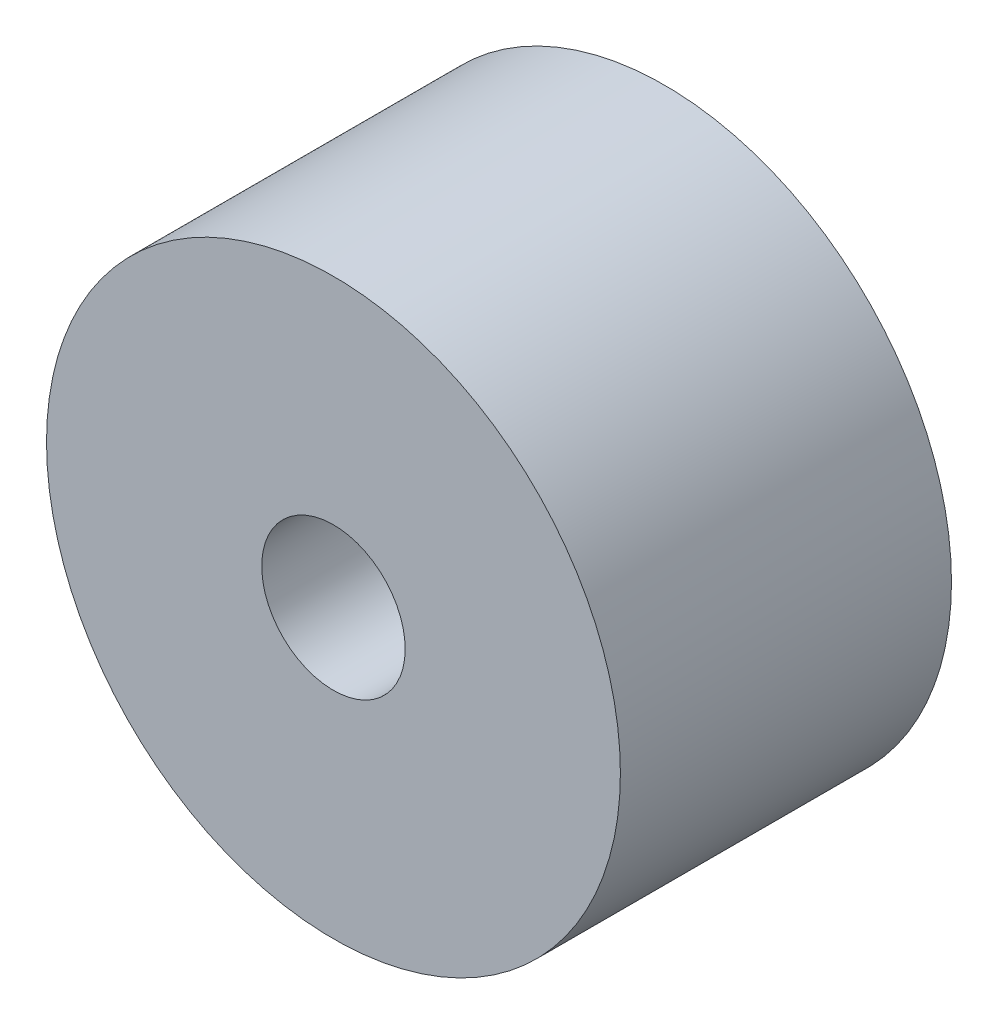
ISO-10303-21;
HEADER;
FILE_DESCRIPTION(('STEP AP214'),'2;1');
FILE_NAME('part.step','',(''),(''),'','','');
FILE_SCHEMA(('AUTOMOTIVE_DESIGN { 1 0 10303 214 1 1 1 1 }'));
ENDSEC;
DATA;
#1=APPLICATION_CONTEXT('core data for automotive mechanical design processes');
#2=APPLICATION_PROTOCOL_DEFINITION('international standard','automotive_design',2000,#1);
#3=PRODUCT_CONTEXT('',#1,'mechanical');
#4=PRODUCT('Part','Part','',(#3));
#5=PRODUCT_RELATED_PRODUCT_CATEGORY('part','',(#4));
#6=PRODUCT_DEFINITION_FORMATION('','',#4);
#7=PRODUCT_DEFINITION_CONTEXT('part definition',#1,'design');
#8=PRODUCT_DEFINITION('design','',#6,#7);
#9=PRODUCT_DEFINITION_SHAPE('','',#8);
#10=(LENGTH_UNIT() NAMED_UNIT(*) SI_UNIT(.MILLI.,.METRE.));
#11=(NAMED_UNIT(*) PLANE_ANGLE_UNIT() SI_UNIT($,.RADIAN.));
#12=(NAMED_UNIT(*) SI_UNIT($,.STERADIAN.) SOLID_ANGLE_UNIT());
#13=UNCERTAINTY_MEASURE_WITH_UNIT(LENGTH_MEASURE(1.E-05),#10,'distance_accuracy_value','');
#14=(GEOMETRIC_REPRESENTATION_CONTEXT(3) GLOBAL_UNCERTAINTY_ASSIGNED_CONTEXT((#13)) GLOBAL_UNIT_ASSIGNED_CONTEXT((#10,
#11,#12)) REPRESENTATION_CONTEXT('',''));
#15=CARTESIAN_POINT('',(0.,0.,0.));
#16=DIRECTION('',(0.,0.,1.));
#17=DIRECTION('',(1.,0.,0.));
#18=AXIS2_PLACEMENT_3D('',#15,#16,#17);
#19=CARTESIAN_POINT('',(0.,0.,3.));
#20=DIRECTION('',(0.,0.,1.));
#21=DIRECTION('',(1.,0.,0.));
#22=AXIS2_PLACEMENT_3D('',#19,#20,#21);
#23=PLANE('',#22);
#24=CARTESIAN_POINT('',(0.,0.,3.));
#25=DIRECTION('',(0.,0.,1.));
#26=DIRECTION('',(1.,0.,0.));
#27=AXIS2_PLACEMENT_3D('',#24,#25,#26);
#28=CIRCLE('',#27,2.6);
#29=CARTESIAN_POINT('',(2.6,0.,3.));
#30=VERTEX_POINT('',#29);
#31=EDGE_CURVE('E10',#30,#30,#28,.T.);
#32=ORIENTED_EDGE('',*,*,#31,.T.);
#33=EDGE_LOOP('',(#32));
#34=FACE_BOUND('',#33,.T.);
#35=CARTESIAN_POINT('',(0.,0.,3.));
#36=DIRECTION('',(0.,0.,1.));
#37=DIRECTION('',(1.,0.,0.));
#38=AXIS2_PLACEMENT_3D('',#35,#36,#37);
#39=CIRCLE('',#38,0.65);
#40=CARTESIAN_POINT('',(0.65,0.,3.));
#41=VERTEX_POINT('',#40);
#42=EDGE_CURVE('E48',#41,#41,#39,.T.);
#43=ORIENTED_EDGE('',*,*,#42,.F.);
#44=EDGE_LOOP('',(#43));
#45=FACE_BOUND('',#44,.T.);
#46=ADVANCED_FACE('F40',(#34,#45),#23,.T.);
#47=CARTESIAN_POINT('',(0.,0.,0.));
#48=DIRECTION('',(0.,0.,1.));
#49=DIRECTION('',(1.,0.,0.));
#50=AXIS2_PLACEMENT_3D('',#47,#48,#49);
#51=PLANE('',#50);
#52=CARTESIAN_POINT('',(0.,0.,0.));
#53=DIRECTION('',(0.,0.,1.));
#54=DIRECTION('',(1.,0.,0.));
#55=AXIS2_PLACEMENT_3D('',#52,#53,#54);
#56=CIRCLE('',#55,2.6);
#57=CARTESIAN_POINT('',(2.6,0.,0.));
#58=VERTEX_POINT('',#57);
#59=EDGE_CURVE('E41',#58,#58,#56,.T.);
#60=ORIENTED_EDGE('',*,*,#59,.F.);
#61=EDGE_LOOP('',(#60));
#62=FACE_BOUND('',#61,.T.);
#63=CARTESIAN_POINT('',(0.,0.,0.));
#64=DIRECTION('',(0.,0.,1.));
#65=DIRECTION('',(1.,0.,0.));
#66=AXIS2_PLACEMENT_3D('',#63,#64,#65);
#67=CIRCLE('',#66,0.65);
#68=CARTESIAN_POINT('',(0.65,0.,0.));
#69=VERTEX_POINT('',#68);
#70=EDGE_CURVE('E49',#69,#69,#67,.T.);
#71=ORIENTED_EDGE('',*,*,#70,.T.);
#72=EDGE_LOOP('',(#71));
#73=FACE_BOUND('',#72,.T.);
#74=ADVANCED_FACE('F58',(#62,#73),#51,.F.);
#75=CARTESIAN_POINT('',(0.,0.,3.));
#76=DIRECTION('',(0.,0.,-1.));
#77=DIRECTION('',(-1.,0.,0.));
#78=AXIS2_PLACEMENT_3D('',#75,#76,#77);
#79=CYLINDRICAL_SURFACE('',#78,2.6);
#80=ORIENTED_EDGE('',*,*,#31,.F.);
#81=EDGE_LOOP('',(#80));
#82=FACE_BOUND('',#81,.T.);
#83=ORIENTED_EDGE('',*,*,#59,.T.);
#84=EDGE_LOOP('',(#83));
#85=FACE_BOUND('',#84,.T.);
#86=ADVANCED_FACE('F39',(#82,#85),#79,.T.);
#87=CARTESIAN_POINT('',(0.,0.,3.));
#88=DIRECTION('',(0.,0.,-1.));
#89=DIRECTION('',(-1.,0.,0.));
#90=AXIS2_PLACEMENT_3D('',#87,#88,#89);
#91=CYLINDRICAL_SURFACE('',#90,0.65);
#92=ORIENTED_EDGE('',*,*,#42,.T.);
#93=EDGE_LOOP('',(#92));
#94=FACE_BOUND('',#93,.T.);
#95=ORIENTED_EDGE('',*,*,#70,.F.);
#96=EDGE_LOOP('',(#95));
#97=FACE_BOUND('',#96,.T.);
#98=ADVANCED_FACE('F57',(#94,#97),#91,.F.);
#99=CLOSED_SHELL('',(#46,#74,#86,#98));
#100=MANIFOLD_SOLID_BREP('B2',#99);
#101=ADVANCED_BREP_SHAPE_REPRESENTATION('',(#18,#100),#14);
#102=SHAPE_DEFINITION_REPRESENTATION(#9,#101);
ENDSEC;
END-ISO-10303-21;
